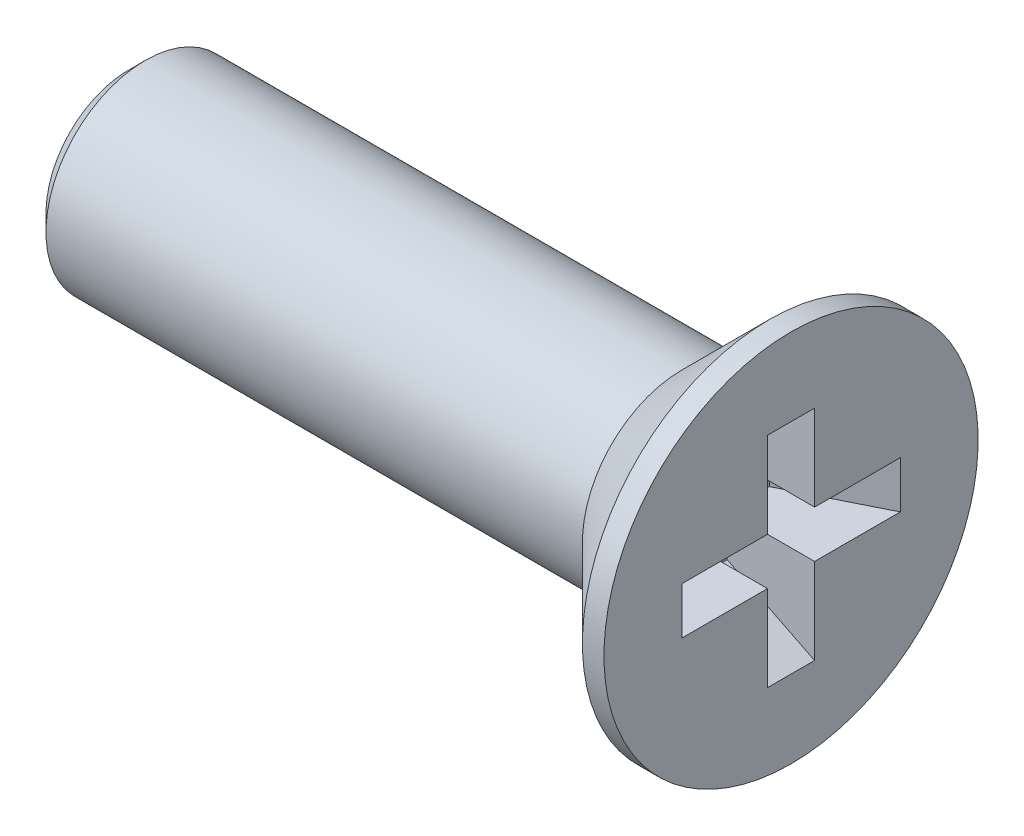
ISO-10303-21;
HEADER;
FILE_DESCRIPTION(('STEP AP214'),'2;1');
FILE_NAME('part.step','',(''),(''),'','','');
FILE_SCHEMA(('AUTOMOTIVE_DESIGN { 1 0 10303 214 1 1 1 1 }'));
ENDSEC;
DATA;
#1=APPLICATION_CONTEXT('core data for automotive mechanical design processes');
#2=APPLICATION_PROTOCOL_DEFINITION('international standard','automotive_design',2000,#1);
#3=PRODUCT_CONTEXT('',#1,'mechanical');
#4=PRODUCT('Part','Part','',(#3));
#5=PRODUCT_RELATED_PRODUCT_CATEGORY('part','',(#4));
#6=PRODUCT_DEFINITION_FORMATION('','',#4);
#7=PRODUCT_DEFINITION_CONTEXT('part definition',#1,'design');
#8=PRODUCT_DEFINITION('design','',#6,#7);
#9=PRODUCT_DEFINITION_SHAPE('','',#8);
#10=(LENGTH_UNIT() NAMED_UNIT(*) SI_UNIT(.MILLI.,.METRE.));
#11=(NAMED_UNIT(*) PLANE_ANGLE_UNIT() SI_UNIT($,.RADIAN.));
#12=(NAMED_UNIT(*) SI_UNIT($,.STERADIAN.) SOLID_ANGLE_UNIT());
#13=UNCERTAINTY_MEASURE_WITH_UNIT(LENGTH_MEASURE(1.E-05),#10,'distance_accuracy_value','');
#14=(GEOMETRIC_REPRESENTATION_CONTEXT(3) GLOBAL_UNCERTAINTY_ASSIGNED_CONTEXT((#13)) GLOBAL_UNIT_ASSIGNED_CONTEXT((#10,
#11,#12)) REPRESENTATION_CONTEXT('',''));
#15=CARTESIAN_POINT('',(0.,0.,0.));
#16=DIRECTION('',(0.,0.,1.));
#17=DIRECTION('',(1.,0.,0.));
#18=AXIS2_PLACEMENT_3D('',#15,#16,#17);
#19=CARTESIAN_POINT('',(0.,0.,0.));
#20=DIRECTION('',(1.,0.,0.));
#21=DIRECTION('',(0.,1.,0.));
#22=AXIS2_PLACEMENT_3D('',#19,#20,#21);
#23=PLANE('',#22);
#24=CARTESIAN_POINT('',(0.,0.,0.));
#25=DIRECTION('',(1.,0.,0.));
#26=DIRECTION('',(0.,1.,0.));
#27=AXIS2_PLACEMENT_3D('',#24,#25,#26);
#28=CIRCLE('',#27,5.65);
#29=CARTESIAN_POINT('',(0.,5.65,0.));
#30=VERTEX_POINT('',#29);
#31=EDGE_CURVE('E195',#30,#30,#28,.T.);
#32=ORIENTED_EDGE('',*,*,#31,.T.);
#33=EDGE_LOOP('',(#32));
#34=FACE_BOUND('',#33,.T.);
#35=DIRECTION('',(0.,0.,-1.));
#36=VECTOR('',#35,1.);
#37=CARTESIAN_POINT('',(0.,3.3,0.));
#38=LINE('',#37,#36);
#39=CARTESIAN_POINT('',(0.,3.3,0.71));
#40=VERTEX_POINT('',#39);
#41=CARTESIAN_POINT('',(0.,3.3,-0.71));
#42=VERTEX_POINT('',#41);
#43=EDGE_CURVE('E150',#40,#42,#38,.T.);
#44=ORIENTED_EDGE('',*,*,#43,.T.);
#45=DIRECTION('',(0.,-1.,0.));
#46=VECTOR('',#45,1.);
#47=CARTESIAN_POINT('',(0.,0.,-0.71));
#48=LINE('',#47,#46);
#49=CARTESIAN_POINT('',(0.,0.71,-0.71));
#50=VERTEX_POINT('',#49);
#51=EDGE_CURVE('E53',#42,#50,#48,.T.);
#52=ORIENTED_EDGE('',*,*,#51,.T.);
#53=DIRECTION('',(0.,0.,-1.));
#54=VECTOR('',#53,1.);
#55=CARTESIAN_POINT('',(0.,0.71,0.));
#56=LINE('',#55,#54);
#57=CARTESIAN_POINT('',(0.,0.71,-3.3));
#58=VERTEX_POINT('',#57);
#59=EDGE_CURVE('E134',#50,#58,#56,.T.);
#60=ORIENTED_EDGE('',*,*,#59,.T.);
#61=DIRECTION('',(0.,-1.,0.));
#62=VECTOR('',#61,1.);
#63=CARTESIAN_POINT('',(0.,0.,-3.3));
#64=LINE('',#63,#62);
#65=CARTESIAN_POINT('',(0.,-0.71,-3.3));
#66=VERTEX_POINT('',#65);
#67=EDGE_CURVE('E140',#58,#66,#64,.T.);
#68=ORIENTED_EDGE('',*,*,#67,.T.);
#69=DIRECTION('',(0.,0.,-1.));
#70=VECTOR('',#69,1.);
#71=CARTESIAN_POINT('',(0.,-0.71,0.));
#72=LINE('',#71,#70);
#73=CARTESIAN_POINT('',(0.,-0.71,-0.71));
#74=VERTEX_POINT('',#73);
#75=EDGE_CURVE('E176',#74,#66,#72,.T.);
#76=ORIENTED_EDGE('',*,*,#75,.F.);
#77=DIRECTION('',(0.,-1.,0.));
#78=VECTOR('',#77,1.);
#79=CARTESIAN_POINT('',(0.,0.,-0.71));
#80=LINE('',#79,#78);
#81=CARTESIAN_POINT('',(0.,-3.3,-0.710000000000001));
#82=VERTEX_POINT('',#81);
#83=EDGE_CURVE('E173',#74,#82,#80,.T.);
#84=ORIENTED_EDGE('',*,*,#83,.T.);
#85=DIRECTION('',(0.,0.,-1.));
#86=VECTOR('',#85,1.);
#87=CARTESIAN_POINT('',(0.,-3.3,0.));
#88=LINE('',#87,#86);
#89=CARTESIAN_POINT('',(0.,-3.3,0.709999999999999));
#90=VERTEX_POINT('',#89);
#91=EDGE_CURVE('E170',#90,#82,#88,.T.);
#92=ORIENTED_EDGE('',*,*,#91,.F.);
#93=DIRECTION('',(0.,-1.,0.));
#94=VECTOR('',#93,1.);
#95=CARTESIAN_POINT('',(0.,0.,0.71));
#96=LINE('',#95,#94);
#97=CARTESIAN_POINT('',(0.,-0.71,0.71));
#98=VERTEX_POINT('',#97);
#99=EDGE_CURVE('E168',#98,#90,#96,.T.);
#100=ORIENTED_EDGE('',*,*,#99,.F.);
#101=DIRECTION('',(0.,0.,-1.));
#102=VECTOR('',#101,1.);
#103=CARTESIAN_POINT('',(0.,-0.71,0.));
#104=LINE('',#103,#102);
#105=CARTESIAN_POINT('',(0.,-0.71,3.3));
#106=VERTEX_POINT('',#105);
#107=EDGE_CURVE('E166',#106,#98,#104,.T.);
#108=ORIENTED_EDGE('',*,*,#107,.F.);
#109=DIRECTION('',(0.,-1.,0.));
#110=VECTOR('',#109,1.);
#111=CARTESIAN_POINT('',(0.,0.,3.3));
#112=LINE('',#111,#110);
#113=CARTESIAN_POINT('',(0.,0.71,3.3));
#114=VERTEX_POINT('',#113);
#115=EDGE_CURVE('E163',#114,#106,#112,.T.);
#116=ORIENTED_EDGE('',*,*,#115,.F.);
#117=DIRECTION('',(0.,0.,-1.));
#118=VECTOR('',#117,1.);
#119=CARTESIAN_POINT('',(0.,0.71,0.));
#120=LINE('',#119,#118);
#121=CARTESIAN_POINT('',(0.,0.71,0.71));
#122=VERTEX_POINT('',#121);
#123=EDGE_CURVE('E160',#114,#122,#120,.T.);
#124=ORIENTED_EDGE('',*,*,#123,.T.);
#125=DIRECTION('',(0.,-1.,0.));
#126=VECTOR('',#125,1.);
#127=CARTESIAN_POINT('',(0.,0.,0.71));
#128=LINE('',#127,#126);
#129=EDGE_CURVE('E152',#40,#122,#128,.T.);
#130=ORIENTED_EDGE('',*,*,#129,.F.);
#131=EDGE_LOOP('',(#44,#52,#60,#68,#76,#84,#92,#100,#108,#116,#124,#130));
#132=FACE_BOUND('',#131,.T.);
#133=ADVANCED_FACE('F36',(#34,#132),#23,.T.);
#134=CARTESIAN_POINT('',(0.,0.,0.));
#135=DIRECTION('',(1.,0.,0.));
#136=DIRECTION('',(0.,1.,0.));
#137=AXIS2_PLACEMENT_3D('',#134,#135,#136);
#138=CYLINDRICAL_SURFACE('',#137,5.65);
#139=CARTESIAN_POINT('',(-0.65000000000001,0.,0.));
#140=DIRECTION('',(1.,0.,0.));
#141=DIRECTION('',(0.,1.,0.));
#142=AXIS2_PLACEMENT_3D('',#139,#140,#141);
#143=CIRCLE('',#142,5.65);
#144=CARTESIAN_POINT('',(-0.65000000000001,5.65,0.));
#145=VERTEX_POINT('',#144);
#146=EDGE_CURVE('E192',#145,#145,#143,.T.);
#147=ORIENTED_EDGE('',*,*,#146,.T.);
#148=EDGE_LOOP('',(#147));
#149=FACE_BOUND('',#148,.T.);
#150=ORIENTED_EDGE('',*,*,#31,.F.);
#151=EDGE_LOOP('',(#150));
#152=FACE_BOUND('',#151,.T.);
#153=ADVANCED_FACE('F239',(#149,#152),#138,.T.);
#154=CARTESIAN_POINT('',(-0.65000000000001,0.,0.));
#155=DIRECTION('',(1.,0.,0.));
#156=DIRECTION('',(0.,1.,0.));
#157=AXIS2_PLACEMENT_3D('',#154,#155,#156);
#158=CONICAL_SURFACE('',#157,5.65,0.78539816339745);
#159=CARTESIAN_POINT('',(-3.3,0.,0.));
#160=DIRECTION('',(1.,0.,0.));
#161=DIRECTION('',(0.,1.,0.));
#162=AXIS2_PLACEMENT_3D('',#159,#160,#161);
#163=CIRCLE('',#162,3.);
#164=CARTESIAN_POINT('',(-3.3,3.,0.));
#165=VERTEX_POINT('',#164);
#166=EDGE_CURVE('E145',#165,#165,#163,.T.);
#167=ORIENTED_EDGE('',*,*,#166,.T.);
#168=EDGE_LOOP('',(#167));
#169=FACE_BOUND('',#168,.T.);
#170=ORIENTED_EDGE('',*,*,#146,.F.);
#171=EDGE_LOOP('',(#170));
#172=FACE_BOUND('',#171,.T.);
#173=ADVANCED_FACE('F245',(#169,#172),#158,.T.);
#174=CARTESIAN_POINT('',(0.,0.,0.));
#175=DIRECTION('',(1.,0.,0.));
#176=DIRECTION('',(0.,1.,0.));
#177=AXIS2_PLACEMENT_3D('',#174,#175,#176);
#178=CYLINDRICAL_SURFACE('',#177,3.);
#179=CARTESIAN_POINT('',(-19.5,0.,0.));
#180=DIRECTION('',(-1.,0.,0.));
#181=DIRECTION('',(0.,-1.,0.));
#182=AXIS2_PLACEMENT_3D('',#179,#180,#181);
#183=CIRCLE('',#182,3.);
#184=CARTESIAN_POINT('',(-19.5,-3.,0.));
#185=VERTEX_POINT('',#184);
#186=EDGE_CURVE('E45',#185,#185,#183,.F.);
#187=ORIENTED_EDGE('',*,*,#186,.T.);
#188=EDGE_LOOP('',(#187));
#189=FACE_BOUND('',#188,.T.);
#190=ORIENTED_EDGE('',*,*,#166,.F.);
#191=EDGE_LOOP('',(#190));
#192=FACE_BOUND('',#191,.T.);
#193=ADVANCED_FACE('F225',(#189,#192),#178,.T.);
#194=CARTESIAN_POINT('',(-20.,3.,0.));
#195=DIRECTION('',(-1.,0.,0.));
#196=DIRECTION('',(0.,-1.,0.));
#197=AXIS2_PLACEMENT_3D('',#194,#195,#196);
#198=PLANE('',#197);
#199=CARTESIAN_POINT('',(-20.,0.,0.));
#200=DIRECTION('',(-1.,0.,0.));
#201=DIRECTION('',(0.,-1.,0.));
#202=AXIS2_PLACEMENT_3D('',#199,#200,#201);
#203=CIRCLE('',#202,2.5);
#204=CARTESIAN_POINT('',(-20.,-2.5,0.));
#205=VERTEX_POINT('',#204);
#206=EDGE_CURVE('E11',#205,#205,#203,.T.);
#207=ORIENTED_EDGE('',*,*,#206,.T.);
#208=EDGE_LOOP('',(#207));
#209=FACE_BOUND('',#208,.T.);
#210=ADVANCED_FACE('F314',(#209),#198,.T.);
#211=CARTESIAN_POINT('',(-2.64,0.,-0.71));
#212=DIRECTION('',(0.,0.,1.));
#213=DIRECTION('',(0.,-1.,0.));
#214=AXIS2_PLACEMENT_3D('',#211,#212,#213);
#215=PLANE('',#214);
#216=ORIENTED_EDGE('',*,*,#51,.F.);
#217=DIRECTION('',(0.894934361602025,0.44619781310981,0.));
#218=VECTOR('',#217,1.);
#219=CARTESIAN_POINT('',(-3.43214442213874,1.58879591493845,-0.71));
#220=LINE('',#219,#218);
#221=CARTESIAN_POINT('',(-2.64,1.98374455473894,-0.71));
#222=VERTEX_POINT('',#221);
#223=EDGE_CURVE('E203',#222,#42,#220,.T.);
#224=ORIENTED_EDGE('',*,*,#223,.F.);
#225=DIRECTION('',(0.,-1.,0.));
#226=VECTOR('',#225,1.);
#227=CARTESIAN_POINT('',(-2.64,0.,-0.71));
#228=LINE('',#227,#226);
#229=CARTESIAN_POINT('',(-2.64,0.71,-0.71));
#230=VERTEX_POINT('',#229);
#231=EDGE_CURVE('E139',#222,#230,#228,.T.);
#232=ORIENTED_EDGE('',*,*,#231,.T.);
#233=DIRECTION('',(1.,0.,0.));
#234=VECTOR('',#233,1.);
#235=CARTESIAN_POINT('',(-2.64,0.71,-0.71));
#236=LINE('',#235,#234);
#237=EDGE_CURVE('E136',#230,#50,#236,.T.);
#238=ORIENTED_EDGE('',*,*,#237,.T.);
#239=EDGE_LOOP('',(#216,#224,#232,#238));
#240=FACE_BOUND('',#239,.T.);
#241=ADVANCED_FACE('F143',(#240),#215,.T.);
#242=CARTESIAN_POINT('',(-2.64,0.71,0.));
#243=DIRECTION('',(0.,-1.,0.));
#244=DIRECTION('',(1.,0.,0.));
#245=AXIS2_PLACEMENT_3D('',#242,#243,#244);
#246=PLANE('',#245);
#247=ORIENTED_EDGE('',*,*,#59,.F.);
#248=ORIENTED_EDGE('',*,*,#237,.F.);
#249=DIRECTION('',(0.,0.,-1.));
#250=VECTOR('',#249,1.);
#251=CARTESIAN_POINT('',(-2.64,0.71,0.));
#252=LINE('',#251,#250);
#253=CARTESIAN_POINT('',(-2.64,0.71,-1.98374455473894));
#254=VERTEX_POINT('',#253);
#255=EDGE_CURVE('E155',#230,#254,#252,.T.);
#256=ORIENTED_EDGE('',*,*,#255,.T.);
#257=DIRECTION('',(0.894934361602025,0.,-0.44619781310981));
#258=VECTOR('',#257,1.);
#259=CARTESIAN_POINT('',(0.,0.71,-3.3));
#260=LINE('',#259,#258);
#261=EDGE_CURVE('E130',#254,#58,#260,.T.);
#262=ORIENTED_EDGE('',*,*,#261,.T.);
#263=EDGE_LOOP('',(#247,#248,#256,#262));
#264=FACE_BOUND('',#263,.T.);
#265=ADVANCED_FACE('F135',(#264),#246,.T.);
#266=CARTESIAN_POINT('',(0.,0.,-3.3));
#267=DIRECTION('',(0.44619781310981,0.,0.894934361602025));
#268=DIRECTION('',(0.894934361602025,0.,-0.44619781310981));
#269=AXIS2_PLACEMENT_3D('',#266,#267,#268);
#270=PLANE('',#269);
#271=ORIENTED_EDGE('',*,*,#67,.F.);
#272=ORIENTED_EDGE('',*,*,#261,.F.);
#273=DIRECTION('',(0.,-1.,0.));
#274=VECTOR('',#273,1.);
#275=CARTESIAN_POINT('',(-2.64,0.,-1.98374455473894));
#276=LINE('',#275,#274);
#277=CARTESIAN_POINT('',(-2.64,-0.71,-1.98374455473894));
#278=VERTEX_POINT('',#277);
#279=EDGE_CURVE('E199',#254,#278,#276,.T.);
#280=ORIENTED_EDGE('',*,*,#279,.T.);
#281=DIRECTION('',(0.894934361602025,0.,-0.44619781310981));
#282=VECTOR('',#281,1.);
#283=CARTESIAN_POINT('',(0.,-0.71,-3.3));
#284=LINE('',#283,#282);
#285=EDGE_CURVE('E182',#278,#66,#284,.T.);
#286=ORIENTED_EDGE('',*,*,#285,.T.);
#287=EDGE_LOOP('',(#271,#272,#280,#286));
#288=FACE_BOUND('',#287,.T.);
#289=ADVANCED_FACE('F250',(#288),#270,.T.);
#290=CARTESIAN_POINT('',(-2.64,-0.71,0.));
#291=DIRECTION('',(0.,-1.,0.));
#292=DIRECTION('',(1.,0.,0.));
#293=AXIS2_PLACEMENT_3D('',#290,#291,#292);
#294=PLANE('',#293);
#295=ORIENTED_EDGE('',*,*,#75,.T.);
#296=ORIENTED_EDGE('',*,*,#285,.F.);
#297=DIRECTION('',(0.,0.,-1.));
#298=VECTOR('',#297,1.);
#299=CARTESIAN_POINT('',(-2.64,-0.71,0.));
#300=LINE('',#299,#298);
#301=CARTESIAN_POINT('',(-2.64,-0.71,-0.71));
#302=VERTEX_POINT('',#301);
#303=EDGE_CURVE('E201',#302,#278,#300,.T.);
#304=ORIENTED_EDGE('',*,*,#303,.F.);
#305=DIRECTION('',(1.,0.,0.));
#306=VECTOR('',#305,1.);
#307=CARTESIAN_POINT('',(-2.64,-0.71,-0.71));
#308=LINE('',#307,#306);
#309=EDGE_CURVE('E180',#302,#74,#308,.T.);
#310=ORIENTED_EDGE('',*,*,#309,.T.);
#311=EDGE_LOOP('',(#295,#296,#304,#310));
#312=FACE_BOUND('',#311,.T.);
#313=ADVANCED_FACE('F253',(#312),#294,.F.);
#314=CARTESIAN_POINT('',(-2.64,0.,-0.71));
#315=DIRECTION('',(0.,0.,1.));
#316=DIRECTION('',(0.,-1.,0.));
#317=AXIS2_PLACEMENT_3D('',#314,#315,#316);
#318=PLANE('',#317);
#319=ORIENTED_EDGE('',*,*,#83,.F.);
#320=ORIENTED_EDGE('',*,*,#309,.F.);
#321=DIRECTION('',(0.,-1.,0.));
#322=VECTOR('',#321,1.);
#323=CARTESIAN_POINT('',(-2.64,0.,-0.71));
#324=LINE('',#323,#322);
#325=CARTESIAN_POINT('',(-2.64,-1.98374455473894,-0.71));
#326=VERTEX_POINT('',#325);
#327=EDGE_CURVE('E220',#302,#326,#324,.T.);
#328=ORIENTED_EDGE('',*,*,#327,.T.);
#329=DIRECTION('',(-0.894934361602025,0.44619781310981,0.));
#330=VECTOR('',#329,1.);
#331=CARTESIAN_POINT('',(-3.43214442213874,-1.58879591493845,-0.71));
#332=LINE('',#331,#330);
#333=EDGE_CURVE('E183',#326,#82,#332,.F.);
#334=ORIENTED_EDGE('',*,*,#333,.T.);
#335=EDGE_LOOP('',(#319,#320,#328,#334));
#336=FACE_BOUND('',#335,.T.);
#337=ADVANCED_FACE('F259',(#336),#318,.T.);
#338=CARTESIAN_POINT('',(0.,-3.3,0.));
#339=DIRECTION('',(0.44619781310981,0.894934361602025,0.));
#340=DIRECTION('',(-0.894934361602025,0.44619781310981,0.));
#341=AXIS2_PLACEMENT_3D('',#338,#339,#340);
#342=PLANE('',#341);
#343=ORIENTED_EDGE('',*,*,#91,.T.);
#344=ORIENTED_EDGE('',*,*,#333,.F.);
#345=DIRECTION('',(0.,0.,1.));
#346=VECTOR('',#345,1.);
#347=CARTESIAN_POINT('',(-2.64,-1.98374455473894,0.));
#348=LINE('',#347,#346);
#349=CARTESIAN_POINT('',(-2.64,-1.98374455473894,0.71));
#350=VERTEX_POINT('',#349);
#351=EDGE_CURVE('E217',#350,#326,#348,.F.);
#352=ORIENTED_EDGE('',*,*,#351,.F.);
#353=DIRECTION('',(-0.894934361602025,0.44619781310981,0.));
#354=VECTOR('',#353,1.);
#355=CARTESIAN_POINT('',(-3.43214442213874,-1.58879591493845,0.71));
#356=LINE('',#355,#354);
#357=EDGE_CURVE('E87',#350,#90,#356,.F.);
#358=ORIENTED_EDGE('',*,*,#357,.T.);
#359=EDGE_LOOP('',(#343,#344,#352,#358));
#360=FACE_BOUND('',#359,.T.);
#361=ADVANCED_FACE('F255',(#360),#342,.T.);
#362=CARTESIAN_POINT('',(-2.64,0.,0.71));
#363=DIRECTION('',(0.,0.,1.));
#364=DIRECTION('',(0.,-1.,0.));
#365=AXIS2_PLACEMENT_3D('',#362,#363,#364);
#366=PLANE('',#365);
#367=ORIENTED_EDGE('',*,*,#99,.T.);
#368=ORIENTED_EDGE('',*,*,#357,.F.);
#369=DIRECTION('',(0.,-1.,0.));
#370=VECTOR('',#369,1.);
#371=CARTESIAN_POINT('',(-2.64,0.,0.71));
#372=LINE('',#371,#370);
#373=CARTESIAN_POINT('',(-2.64,-0.71,0.71));
#374=VERTEX_POINT('',#373);
#375=EDGE_CURVE('E221',#374,#350,#372,.T.);
#376=ORIENTED_EDGE('',*,*,#375,.F.);
#377=DIRECTION('',(1.,0.,0.));
#378=VECTOR('',#377,1.);
#379=CARTESIAN_POINT('',(-2.64,-0.71,0.71));
#380=LINE('',#379,#378);
#381=EDGE_CURVE('E96',#374,#98,#380,.T.);
#382=ORIENTED_EDGE('',*,*,#381,.T.);
#383=EDGE_LOOP('',(#367,#368,#376,#382));
#384=FACE_BOUND('',#383,.T.);
#385=ADVANCED_FACE('F258',(#384),#366,.F.);
#386=CARTESIAN_POINT('',(-2.64,-0.71,0.));
#387=DIRECTION('',(0.,-1.,0.));
#388=DIRECTION('',(1.,0.,0.));
#389=AXIS2_PLACEMENT_3D('',#386,#387,#388);
#390=PLANE('',#389);
#391=ORIENTED_EDGE('',*,*,#107,.T.);
#392=ORIENTED_EDGE('',*,*,#381,.F.);
#393=DIRECTION('',(0.,0.,-1.));
#394=VECTOR('',#393,1.);
#395=CARTESIAN_POINT('',(-2.64,-0.71,0.));
#396=LINE('',#395,#394);
#397=CARTESIAN_POINT('',(-2.64,-0.71,1.98374455473894));
#398=VERTEX_POINT('',#397);
#399=EDGE_CURVE('E213',#398,#374,#396,.T.);
#400=ORIENTED_EDGE('',*,*,#399,.F.);
#401=DIRECTION('',(-0.894934361602025,0.,-0.44619781310981));
#402=VECTOR('',#401,1.);
#403=CARTESIAN_POINT('',(0.,-0.71,3.3));
#404=LINE('',#403,#402);
#405=EDGE_CURVE('E185',#398,#106,#404,.F.);
#406=ORIENTED_EDGE('',*,*,#405,.T.);
#407=EDGE_LOOP('',(#391,#392,#400,#406));
#408=FACE_BOUND('',#407,.T.);
#409=ADVANCED_FACE('F264',(#408),#390,.F.);
#410=CARTESIAN_POINT('',(0.,0.,3.3));
#411=DIRECTION('',(0.44619781310981,0.,-0.894934361602025));
#412=DIRECTION('',(-0.894934361602025,0.,-0.44619781310981));
#413=AXIS2_PLACEMENT_3D('',#410,#411,#412);
#414=PLANE('',#413);
#415=ORIENTED_EDGE('',*,*,#115,.T.);
#416=ORIENTED_EDGE('',*,*,#405,.F.);
#417=DIRECTION('',(0.,1.,0.));
#418=VECTOR('',#417,1.);
#419=CARTESIAN_POINT('',(-2.64,0.,1.98374455473894));
#420=LINE('',#419,#418);
#421=CARTESIAN_POINT('',(-2.64,0.71,1.98374455473894));
#422=VERTEX_POINT('',#421);
#423=EDGE_CURVE('E210',#422,#398,#420,.F.);
#424=ORIENTED_EDGE('',*,*,#423,.F.);
#425=DIRECTION('',(-0.894934361602025,0.,-0.44619781310981));
#426=VECTOR('',#425,1.);
#427=CARTESIAN_POINT('',(0.,0.71,3.3));
#428=LINE('',#427,#426);
#429=EDGE_CURVE('E188',#422,#114,#428,.F.);
#430=ORIENTED_EDGE('',*,*,#429,.T.);
#431=EDGE_LOOP('',(#415,#416,#424,#430));
#432=FACE_BOUND('',#431,.T.);
#433=ADVANCED_FACE('F261',(#432),#414,.T.);
#434=CARTESIAN_POINT('',(-2.64,0.71,0.));
#435=DIRECTION('',(0.,-1.,0.));
#436=DIRECTION('',(1.,0.,0.));
#437=AXIS2_PLACEMENT_3D('',#434,#435,#436);
#438=PLANE('',#437);
#439=ORIENTED_EDGE('',*,*,#123,.F.);
#440=ORIENTED_EDGE('',*,*,#429,.F.);
#441=DIRECTION('',(0.,0.,-1.));
#442=VECTOR('',#441,1.);
#443=CARTESIAN_POINT('',(-2.64,0.71,0.));
#444=LINE('',#443,#442);
#445=CARTESIAN_POINT('',(-2.64,0.71,0.71));
#446=VERTEX_POINT('',#445);
#447=EDGE_CURVE('E214',#422,#446,#444,.T.);
#448=ORIENTED_EDGE('',*,*,#447,.T.);
#449=DIRECTION('',(1.,0.,0.));
#450=VECTOR('',#449,1.);
#451=CARTESIAN_POINT('',(-2.64,0.71,0.71));
#452=LINE('',#451,#450);
#453=EDGE_CURVE('E186',#446,#122,#452,.T.);
#454=ORIENTED_EDGE('',*,*,#453,.T.);
#455=EDGE_LOOP('',(#439,#440,#448,#454));
#456=FACE_BOUND('',#455,.T.);
#457=ADVANCED_FACE('F263',(#456),#438,.T.);
#458=CARTESIAN_POINT('',(-2.64,0.,0.71));
#459=DIRECTION('',(0.,0.,1.));
#460=DIRECTION('',(0.,-1.,0.));
#461=AXIS2_PLACEMENT_3D('',#458,#459,#460);
#462=PLANE('',#461);
#463=ORIENTED_EDGE('',*,*,#129,.T.);
#464=ORIENTED_EDGE('',*,*,#453,.F.);
#465=DIRECTION('',(0.,-1.,0.));
#466=VECTOR('',#465,1.);
#467=CARTESIAN_POINT('',(-2.64,0.,0.71));
#468=LINE('',#467,#466);
#469=CARTESIAN_POINT('',(-2.64,1.98374455473894,0.71));
#470=VERTEX_POINT('',#469);
#471=EDGE_CURVE('E207',#470,#446,#468,.T.);
#472=ORIENTED_EDGE('',*,*,#471,.F.);
#473=DIRECTION('',(0.894934361602025,0.44619781310981,0.));
#474=VECTOR('',#473,1.);
#475=CARTESIAN_POINT('',(-3.43214442213874,1.58879591493845,0.71));
#476=LINE('',#475,#474);
#477=EDGE_CURVE('E189',#470,#40,#476,.T.);
#478=ORIENTED_EDGE('',*,*,#477,.T.);
#479=EDGE_LOOP('',(#463,#464,#472,#478));
#480=FACE_BOUND('',#479,.T.);
#481=ADVANCED_FACE('F267',(#480),#462,.F.);
#482=CARTESIAN_POINT('',(0.,3.3,0.));
#483=DIRECTION('',(0.44619781310981,-0.894934361602025,0.));
#484=DIRECTION('',(0.894934361602025,0.44619781310981,0.));
#485=AXIS2_PLACEMENT_3D('',#482,#483,#484);
#486=PLANE('',#485);
#487=ORIENTED_EDGE('',*,*,#43,.F.);
#488=ORIENTED_EDGE('',*,*,#477,.F.);
#489=DIRECTION('',(0.,0.,-1.));
#490=VECTOR('',#489,1.);
#491=CARTESIAN_POINT('',(-2.64,1.98374455473894,0.));
#492=LINE('',#491,#490);
#493=EDGE_CURVE('E205',#470,#222,#492,.T.);
#494=ORIENTED_EDGE('',*,*,#493,.T.);
#495=ORIENTED_EDGE('',*,*,#223,.T.);
#496=EDGE_LOOP('',(#487,#488,#494,#495));
#497=FACE_BOUND('',#496,.T.);
#498=ADVANCED_FACE('F234',(#497),#486,.T.);
#499=CARTESIAN_POINT('',(-2.64,0.,0.));
#500=DIRECTION('',(1.,0.,0.));
#501=DIRECTION('',(0.,1.,0.));
#502=AXIS2_PLACEMENT_3D('',#499,#500,#501);
#503=PLANE('',#502);
#504=ORIENTED_EDGE('',*,*,#231,.F.);
#505=ORIENTED_EDGE('',*,*,#493,.F.);
#506=ORIENTED_EDGE('',*,*,#471,.T.);
#507=ORIENTED_EDGE('',*,*,#447,.F.);
#508=ORIENTED_EDGE('',*,*,#423,.T.);
#509=ORIENTED_EDGE('',*,*,#399,.T.);
#510=ORIENTED_EDGE('',*,*,#375,.T.);
#511=ORIENTED_EDGE('',*,*,#351,.T.);
#512=ORIENTED_EDGE('',*,*,#327,.F.);
#513=ORIENTED_EDGE('',*,*,#303,.T.);
#514=ORIENTED_EDGE('',*,*,#279,.F.);
#515=ORIENTED_EDGE('',*,*,#255,.F.);
#516=EDGE_LOOP('',(#504,#505,#506,#507,#508,#509,#510,#511,#512,#513,#514,#515));
#517=FACE_BOUND('',#516,.T.);
#518=ADVANCED_FACE('F229',(#517),#503,.T.);
#519=CARTESIAN_POINT('',(-19.5,0.,0.));
#520=DIRECTION('',(1.,0.,0.));
#521=DIRECTION('',(0.,1.,0.));
#522=AXIS2_PLACEMENT_3D('',#519,#520,#521);
#523=CONICAL_SURFACE('',#522,3.,0.785398163397445);
#524=ORIENTED_EDGE('',*,*,#206,.F.);
#525=EDGE_LOOP('',(#524));
#526=FACE_BOUND('',#525,.T.);
#527=ORIENTED_EDGE('',*,*,#186,.F.);
#528=EDGE_LOOP('',(#527));
#529=FACE_BOUND('',#528,.T.);
#530=ADVANCED_FACE('F38',(#526,#529),#523,.T.);
#531=CLOSED_SHELL('',(#133,#153,#173,#193,#210,#241,#265,#289,#313,#337,#361,#385,#409,#433,
#457,#481,#498,#518,#530));
#532=MANIFOLD_SOLID_BREP('B2',#531);
#533=ADVANCED_BREP_SHAPE_REPRESENTATION('',(#18,#532),#14);
#534=SHAPE_DEFINITION_REPRESENTATION(#9,#533);
ENDSEC;
END-ISO-10303-21;
